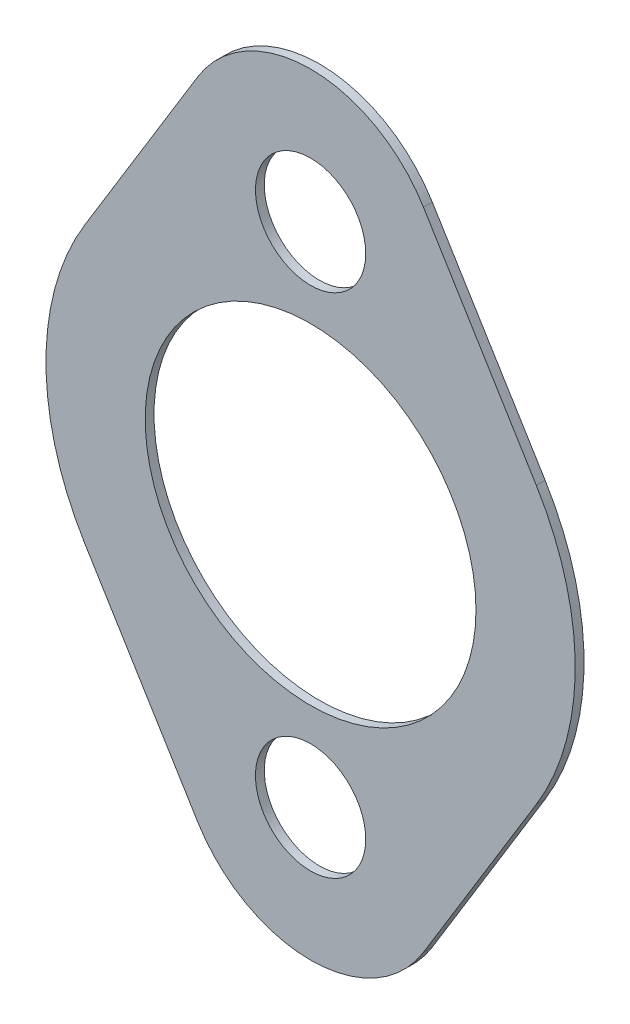
ISO-10303-21;
HEADER;
FILE_DESCRIPTION(('STEP AP214'),'2;1');
FILE_NAME('part.step','',(''),(''),'','','');
FILE_SCHEMA(('AUTOMOTIVE_DESIGN { 1 0 10303 214 1 1 1 1 }'));
ENDSEC;
DATA;
#1=APPLICATION_CONTEXT('core data for automotive mechanical design processes');
#2=APPLICATION_PROTOCOL_DEFINITION('international standard','automotive_design',2000,#1);
#3=PRODUCT_CONTEXT('',#1,'mechanical');
#4=PRODUCT('Part','Part','',(#3));
#5=PRODUCT_RELATED_PRODUCT_CATEGORY('part','',(#4));
#6=PRODUCT_DEFINITION_FORMATION('','',#4);
#7=PRODUCT_DEFINITION_CONTEXT('part definition',#1,'design');
#8=PRODUCT_DEFINITION('design','',#6,#7);
#9=PRODUCT_DEFINITION_SHAPE('','',#8);
#10=(LENGTH_UNIT() NAMED_UNIT(*) SI_UNIT(.MILLI.,.METRE.));
#11=(NAMED_UNIT(*) PLANE_ANGLE_UNIT() SI_UNIT($,.RADIAN.));
#12=(NAMED_UNIT(*) SI_UNIT($,.STERADIAN.) SOLID_ANGLE_UNIT());
#13=UNCERTAINTY_MEASURE_WITH_UNIT(LENGTH_MEASURE(1.E-05),#10,'distance_accuracy_value','');
#14=(GEOMETRIC_REPRESENTATION_CONTEXT(3) GLOBAL_UNCERTAINTY_ASSIGNED_CONTEXT((#13)) GLOBAL_UNIT_ASSIGNED_CONTEXT((#10,
#11,#12)) REPRESENTATION_CONTEXT('',''));
#15=CARTESIAN_POINT('',(0.,0.,0.));
#16=DIRECTION('',(0.,0.,1.));
#17=DIRECTION('',(1.,0.,0.));
#18=AXIS2_PLACEMENT_3D('',#15,#16,#17);
#19=CARTESIAN_POINT('',(0.,57.5,2.));
#20=DIRECTION('',(0.,0.,-1.));
#21=DIRECTION('',(-1.,0.,0.));
#22=AXIS2_PLACEMENT_3D('',#19,#20,#21);
#23=CYLINDRICAL_SURFACE('',#22,30.);
#24=CARTESIAN_POINT('',(0.,57.5,0.));
#25=DIRECTION('',(0.,0.,-1.));
#26=DIRECTION('',(-1.,0.,0.));
#27=AXIS2_PLACEMENT_3D('',#24,#25,#26);
#28=CIRCLE('',#27,30.);
#29=CARTESIAN_POINT('',(-25.5931524395851,73.1521739130435,0.));
#30=VERTEX_POINT('',#29);
#31=CARTESIAN_POINT('',(25.5931524395851,73.1521739130434,0.));
#32=VERTEX_POINT('',#31);
#33=EDGE_CURVE('E142',#30,#32,#28,.T.);
#34=ORIENTED_EDGE('',*,*,#33,.F.);
#35=DIRECTION('',(0.,0.,-1.));
#36=VECTOR('',#35,1.);
#37=CARTESIAN_POINT('',(-25.5931524395851,73.1521739130435,2.));
#38=LINE('',#37,#36);
#39=CARTESIAN_POINT('',(-25.5931524395851,73.1521739130435,2.));
#40=VERTEX_POINT('',#39);
#41=EDGE_CURVE('E11',#40,#30,#38,.T.);
#42=ORIENTED_EDGE('',*,*,#41,.F.);
#43=CARTESIAN_POINT('',(0.,57.5,2.));
#44=DIRECTION('',(0.,0.,-1.));
#45=DIRECTION('',(-1.,0.,0.));
#46=AXIS2_PLACEMENT_3D('',#43,#44,#45);
#47=CIRCLE('',#46,30.);
#48=CARTESIAN_POINT('',(25.5931524395851,73.1521739130434,2.));
#49=VERTEX_POINT('',#48);
#50=EDGE_CURVE('E169',#40,#49,#47,.T.);
#51=ORIENTED_EDGE('',*,*,#50,.T.);
#52=DIRECTION('',(0.,0.,-1.));
#53=VECTOR('',#52,1.);
#54=CARTESIAN_POINT('',(25.5931524395851,73.1521739130434,2.));
#55=LINE('',#54,#53);
#56=EDGE_CURVE('E42',#49,#32,#55,.T.);
#57=ORIENTED_EDGE('',*,*,#56,.T.);
#58=EDGE_LOOP('',(#34,#42,#51,#57));
#59=FACE_BOUND('',#58,.T.);
#60=ADVANCED_FACE('F39',(#59),#23,.T.);
#61=CARTESIAN_POINT('',(-25.5931524395851,73.1521739130435,2.));
#62=DIRECTION('',(0.853105081319504,-0.521739130434783,0.));
#63=DIRECTION('',(0.521739130434783,0.853105081319504,0.));
#64=AXIS2_PLACEMENT_3D('',#61,#62,#63);
#65=PLANE('',#64);
#66=DIRECTION('',(-0.521739130434782,-0.853105081319504,0.));
#67=VECTOR('',#66,1.);
#68=CARTESIAN_POINT('',(-25.5931524395851,73.1521739130435,0.));
#69=LINE('',#68,#67);
#70=CARTESIAN_POINT('',(-51.1863048791702,31.304347826087,0.));
#71=VERTEX_POINT('',#70);
#72=EDGE_CURVE('E167',#30,#71,#69,.T.);
#73=ORIENTED_EDGE('',*,*,#72,.T.);
#74=DIRECTION('',(0.,0.,-1.));
#75=VECTOR('',#74,1.);
#76=CARTESIAN_POINT('',(-51.1863048791702,31.304347826087,2.));
#77=LINE('',#76,#75);
#78=CARTESIAN_POINT('',(-51.1863048791702,31.304347826087,2.));
#79=VERTEX_POINT('',#78);
#80=EDGE_CURVE('E49',#79,#71,#77,.T.);
#81=ORIENTED_EDGE('',*,*,#80,.F.);
#82=DIRECTION('',(-0.521739130434782,-0.853105081319504,0.));
#83=VECTOR('',#82,1.);
#84=CARTESIAN_POINT('',(-25.5931524395851,73.1521739130435,2.));
#85=LINE('',#84,#83);
#86=EDGE_CURVE('E127',#40,#79,#85,.T.);
#87=ORIENTED_EDGE('',*,*,#86,.F.);
#88=ORIENTED_EDGE('',*,*,#41,.T.);
#89=EDGE_LOOP('',(#73,#81,#87,#88));
#90=FACE_BOUND('',#89,.T.);
#91=ADVANCED_FACE('F188',(#90),#65,.F.);
#92=CARTESIAN_POINT('',(0.,0.,2.));
#93=DIRECTION('',(0.,0.,-1.));
#94=DIRECTION('',(-1.,0.,0.));
#95=AXIS2_PLACEMENT_3D('',#92,#93,#94);
#96=CYLINDRICAL_SURFACE('',#95,60.);
#97=CARTESIAN_POINT('',(0.,0.,0.));
#98=DIRECTION('',(0.,0.,-1.));
#99=DIRECTION('',(-1.,0.,0.));
#100=AXIS2_PLACEMENT_3D('',#97,#98,#99);
#101=CIRCLE('',#100,60.);
#102=CARTESIAN_POINT('',(-51.1863048791702,-31.304347826087,0.));
#103=VERTEX_POINT('',#102);
#104=EDGE_CURVE('E114',#103,#71,#101,.T.);
#105=ORIENTED_EDGE('',*,*,#104,.F.);
#106=DIRECTION('',(0.,0.,-1.));
#107=VECTOR('',#106,1.);
#108=CARTESIAN_POINT('',(-51.1863048791702,-31.304347826087,2.));
#109=LINE('',#108,#107);
#110=CARTESIAN_POINT('',(-51.1863048791702,-31.304347826087,2.));
#111=VERTEX_POINT('',#110);
#112=EDGE_CURVE('E109',#111,#103,#109,.T.);
#113=ORIENTED_EDGE('',*,*,#112,.F.);
#114=CARTESIAN_POINT('',(0.,0.,2.));
#115=DIRECTION('',(0.,0.,-1.));
#116=DIRECTION('',(-1.,0.,0.));
#117=AXIS2_PLACEMENT_3D('',#114,#115,#116);
#118=CIRCLE('',#117,60.);
#119=EDGE_CURVE('E112',#111,#79,#118,.T.);
#120=ORIENTED_EDGE('',*,*,#119,.T.);
#121=ORIENTED_EDGE('',*,*,#80,.T.);
#122=EDGE_LOOP('',(#105,#113,#120,#121));
#123=FACE_BOUND('',#122,.T.);
#124=ADVANCED_FACE('F111',(#123),#96,.T.);
#125=CARTESIAN_POINT('',(-25.5931524395851,-73.1521739130435,2.));
#126=DIRECTION('',(-0.853105081319504,-0.521739130434783,0.));
#127=DIRECTION('',(0.521739130434783,-0.853105081319504,0.));
#128=AXIS2_PLACEMENT_3D('',#125,#126,#127);
#129=PLANE('',#128);
#130=DIRECTION('',(-0.521739130434782,0.853105081319504,0.));
#131=VECTOR('',#130,1.);
#132=CARTESIAN_POINT('',(-25.5931524395851,-73.1521739130435,0.));
#133=LINE('',#132,#131);
#134=CARTESIAN_POINT('',(-25.5931524395851,-73.1521739130435,0.));
#135=VERTEX_POINT('',#134);
#136=EDGE_CURVE('E162',#135,#103,#133,.T.);
#137=ORIENTED_EDGE('',*,*,#136,.F.);
#138=DIRECTION('',(0.,0.,-1.));
#139=VECTOR('',#138,1.);
#140=CARTESIAN_POINT('',(-25.5931524395851,-73.1521739130435,2.));
#141=LINE('',#140,#139);
#142=CARTESIAN_POINT('',(-25.5931524395851,-73.1521739130435,2.));
#143=VERTEX_POINT('',#142);
#144=EDGE_CURVE('E120',#143,#135,#141,.T.);
#145=ORIENTED_EDGE('',*,*,#144,.F.);
#146=DIRECTION('',(-0.521739130434782,0.853105081319504,0.));
#147=VECTOR('',#146,1.);
#148=CARTESIAN_POINT('',(-25.5931524395851,-73.1521739130435,2.));
#149=LINE('',#148,#147);
#150=EDGE_CURVE('E126',#143,#111,#149,.T.);
#151=ORIENTED_EDGE('',*,*,#150,.T.);
#152=ORIENTED_EDGE('',*,*,#112,.T.);
#153=EDGE_LOOP('',(#137,#145,#151,#152));
#154=FACE_BOUND('',#153,.T.);
#155=ADVANCED_FACE('F130',(#154),#129,.T.);
#156=CARTESIAN_POINT('',(0.,-57.5,2.));
#157=DIRECTION('',(0.,0.,-1.));
#158=DIRECTION('',(-1.,0.,0.));
#159=AXIS2_PLACEMENT_3D('',#156,#157,#158);
#160=CYLINDRICAL_SURFACE('',#159,30.);
#161=CARTESIAN_POINT('',(0.,-57.5,0.));
#162=DIRECTION('',(0.,0.,1.));
#163=DIRECTION('',(1.,0.,0.));
#164=AXIS2_PLACEMENT_3D('',#161,#162,#163);
#165=CIRCLE('',#164,30.);
#166=CARTESIAN_POINT('',(25.5931524395851,-73.1521739130435,0.));
#167=VERTEX_POINT('',#166);
#168=EDGE_CURVE('E159',#135,#167,#165,.T.);
#169=ORIENTED_EDGE('',*,*,#168,.T.);
#170=DIRECTION('',(0.,0.,-1.));
#171=VECTOR('',#170,1.);
#172=CARTESIAN_POINT('',(25.5931524395851,-73.1521739130435,2.));
#173=LINE('',#172,#171);
#174=CARTESIAN_POINT('',(25.5931524395851,-73.1521739130435,2.));
#175=VERTEX_POINT('',#174);
#176=EDGE_CURVE('E175',#175,#167,#173,.T.);
#177=ORIENTED_EDGE('',*,*,#176,.F.);
#178=CARTESIAN_POINT('',(0.,-57.5,2.));
#179=DIRECTION('',(0.,0.,1.));
#180=DIRECTION('',(1.,0.,0.));
#181=AXIS2_PLACEMENT_3D('',#178,#179,#180);
#182=CIRCLE('',#181,30.);
#183=EDGE_CURVE('E133',#143,#175,#182,.T.);
#184=ORIENTED_EDGE('',*,*,#183,.F.);
#185=ORIENTED_EDGE('',*,*,#144,.T.);
#186=EDGE_LOOP('',(#169,#177,#184,#185));
#187=FACE_BOUND('',#186,.T.);
#188=ADVANCED_FACE('F213',(#187),#160,.T.);
#189=CARTESIAN_POINT('',(25.5931524395851,-73.1521739130434,2.));
#190=DIRECTION('',(-0.853105081319504,0.521739130434782,0.));
#191=DIRECTION('',(-0.521739130434782,-0.853105081319504,0.));
#192=AXIS2_PLACEMENT_3D('',#189,#190,#191);
#193=PLANE('',#192);
#194=DIRECTION('',(0.521739130434782,0.853105081319504,0.));
#195=VECTOR('',#194,1.);
#196=CARTESIAN_POINT('',(25.5931524395851,-73.1521739130434,0.));
#197=LINE('',#196,#195);
#198=CARTESIAN_POINT('',(51.1863048791702,-31.3043478260869,0.));
#199=VERTEX_POINT('',#198);
#200=EDGE_CURVE('E155',#167,#199,#197,.T.);
#201=ORIENTED_EDGE('',*,*,#200,.T.);
#202=DIRECTION('',(0.,0.,-1.));
#203=VECTOR('',#202,1.);
#204=CARTESIAN_POINT('',(51.1863048791702,-31.3043478260869,2.));
#205=LINE('',#204,#203);
#206=CARTESIAN_POINT('',(51.1863048791702,-31.3043478260869,2.));
#207=VERTEX_POINT('',#206);
#208=EDGE_CURVE('E179',#207,#199,#205,.T.);
#209=ORIENTED_EDGE('',*,*,#208,.F.);
#210=DIRECTION('',(0.521739130434782,0.853105081319504,0.));
#211=VECTOR('',#210,1.);
#212=CARTESIAN_POINT('',(25.5931524395851,-73.1521739130434,2.));
#213=LINE('',#212,#211);
#214=EDGE_CURVE('E136',#175,#207,#213,.T.);
#215=ORIENTED_EDGE('',*,*,#214,.F.);
#216=ORIENTED_EDGE('',*,*,#176,.T.);
#217=EDGE_LOOP('',(#201,#209,#215,#216));
#218=FACE_BOUND('',#217,.T.);
#219=ADVANCED_FACE('F207',(#218),#193,.F.);
#220=CARTESIAN_POINT('',(0.,0.,2.));
#221=DIRECTION('',(0.,0.,-1.));
#222=DIRECTION('',(-1.,0.,0.));
#223=AXIS2_PLACEMENT_3D('',#220,#221,#222);
#224=CYLINDRICAL_SURFACE('',#223,60.);
#225=CARTESIAN_POINT('',(0.,0.,0.));
#226=DIRECTION('',(0.,0.,-1.));
#227=DIRECTION('',(-1.,0.,0.));
#228=AXIS2_PLACEMENT_3D('',#225,#226,#227);
#229=CIRCLE('',#228,60.);
#230=CARTESIAN_POINT('',(51.1863048791702,31.3043478260869,0.));
#231=VERTEX_POINT('',#230);
#232=EDGE_CURVE('E151',#231,#199,#229,.T.);
#233=ORIENTED_EDGE('',*,*,#232,.F.);
#234=DIRECTION('',(0.,0.,-1.));
#235=VECTOR('',#234,1.);
#236=CARTESIAN_POINT('',(51.1863048791702,31.3043478260869,2.));
#237=LINE('',#236,#235);
#238=CARTESIAN_POINT('',(51.1863048791702,31.3043478260869,2.));
#239=VERTEX_POINT('',#238);
#240=EDGE_CURVE('E181',#239,#231,#237,.T.);
#241=ORIENTED_EDGE('',*,*,#240,.F.);
#242=CARTESIAN_POINT('',(0.,0.,2.));
#243=DIRECTION('',(0.,0.,-1.));
#244=DIRECTION('',(-1.,0.,0.));
#245=AXIS2_PLACEMENT_3D('',#242,#243,#244);
#246=CIRCLE('',#245,60.);
#247=EDGE_CURVE('E194',#239,#207,#246,.T.);
#248=ORIENTED_EDGE('',*,*,#247,.T.);
#249=ORIENTED_EDGE('',*,*,#208,.T.);
#250=EDGE_LOOP('',(#233,#241,#248,#249));
#251=FACE_BOUND('',#250,.T.);
#252=ADVANCED_FACE('F210',(#251),#224,.T.);
#253=CARTESIAN_POINT('',(25.5931524395851,73.1521739130434,2.));
#254=DIRECTION('',(0.853105081319504,0.521739130434782,0.));
#255=DIRECTION('',(-0.521739130434782,0.853105081319504,0.));
#256=AXIS2_PLACEMENT_3D('',#253,#254,#255);
#257=PLANE('',#256);
#258=DIRECTION('',(0.521739130434782,-0.853105081319504,0.));
#259=VECTOR('',#258,1.);
#260=CARTESIAN_POINT('',(25.5931524395851,73.1521739130434,0.));
#261=LINE('',#260,#259);
#262=EDGE_CURVE('E146',#32,#231,#261,.T.);
#263=ORIENTED_EDGE('',*,*,#262,.F.);
#264=ORIENTED_EDGE('',*,*,#56,.F.);
#265=DIRECTION('',(0.521739130434782,-0.853105081319504,0.));
#266=VECTOR('',#265,1.);
#267=CARTESIAN_POINT('',(25.5931524395851,73.1521739130434,2.));
#268=LINE('',#267,#266);
#269=EDGE_CURVE('E190',#49,#239,#268,.T.);
#270=ORIENTED_EDGE('',*,*,#269,.T.);
#271=ORIENTED_EDGE('',*,*,#240,.T.);
#272=EDGE_LOOP('',(#263,#264,#270,#271));
#273=FACE_BOUND('',#272,.T.);
#274=ADVANCED_FACE('F185',(#273),#257,.T.);
#275=CARTESIAN_POINT('',(0.,57.5,2.));
#276=DIRECTION('',(0.,0.,-1.));
#277=DIRECTION('',(-1.,0.,0.));
#278=AXIS2_PLACEMENT_3D('',#275,#276,#277);
#279=PLANE('',#278);
#280=CARTESIAN_POINT('',(0.,-57.5,2.));
#281=DIRECTION('',(0.,0.,1.));
#282=DIRECTION('',(1.,0.,0.));
#283=AXIS2_PLACEMENT_3D('',#280,#281,#282);
#284=CIRCLE('',#283,12.5);
#285=CARTESIAN_POINT('',(12.5,-57.5,2.));
#286=VERTEX_POINT('',#285);
#287=EDGE_CURVE('E257',#286,#286,#284,.T.);
#288=ORIENTED_EDGE('',*,*,#287,.F.);
#289=EDGE_LOOP('',(#288));
#290=FACE_BOUND('',#289,.T.);
#291=CARTESIAN_POINT('',(0.,0.,2.));
#292=DIRECTION('',(0.,0.,1.));
#293=DIRECTION('',(1.,0.,0.));
#294=AXIS2_PLACEMENT_3D('',#291,#292,#293);
#295=CIRCLE('',#294,37.5);
#296=CARTESIAN_POINT('',(37.5,0.,2.));
#297=VERTEX_POINT('',#296);
#298=EDGE_CURVE('E265',#297,#297,#295,.T.);
#299=ORIENTED_EDGE('',*,*,#298,.F.);
#300=EDGE_LOOP('',(#299));
#301=FACE_BOUND('',#300,.T.);
#302=CARTESIAN_POINT('',(0.,57.5,2.));
#303=DIRECTION('',(0.,0.,1.));
#304=DIRECTION('',(1.,0.,0.));
#305=AXIS2_PLACEMENT_3D('',#302,#303,#304);
#306=CIRCLE('',#305,12.5);
#307=CARTESIAN_POINT('',(12.5,57.5,2.));
#308=VERTEX_POINT('',#307);
#309=EDGE_CURVE('E197',#308,#308,#306,.T.);
#310=ORIENTED_EDGE('',*,*,#309,.F.);
#311=EDGE_LOOP('',(#310));
#312=FACE_BOUND('',#311,.T.);
#313=ORIENTED_EDGE('',*,*,#50,.F.);
#314=ORIENTED_EDGE('',*,*,#86,.T.);
#315=ORIENTED_EDGE('',*,*,#119,.F.);
#316=ORIENTED_EDGE('',*,*,#150,.F.);
#317=ORIENTED_EDGE('',*,*,#183,.T.);
#318=ORIENTED_EDGE('',*,*,#214,.T.);
#319=ORIENTED_EDGE('',*,*,#247,.F.);
#320=ORIENTED_EDGE('',*,*,#269,.F.);
#321=EDGE_LOOP('',(#313,#314,#315,#316,#317,#318,#319,#320));
#322=FACE_BOUND('',#321,.T.);
#323=ADVANCED_FACE('F125',(#290,#301,#312,#322),#279,.F.);
#324=CARTESIAN_POINT('',(0.,57.5,0.));
#325=DIRECTION('',(0.,0.,-1.));
#326=DIRECTION('',(-1.,0.,0.));
#327=AXIS2_PLACEMENT_3D('',#324,#325,#326);
#328=PLANE('',#327);
#329=CARTESIAN_POINT('',(0.,-57.5,0.));
#330=DIRECTION('',(0.,0.,1.));
#331=DIRECTION('',(1.,0.,0.));
#332=AXIS2_PLACEMENT_3D('',#329,#330,#331);
#333=CIRCLE('',#332,12.5);
#334=CARTESIAN_POINT('',(12.5,-57.5,0.));
#335=VERTEX_POINT('',#334);
#336=EDGE_CURVE('E254',#335,#335,#333,.T.);
#337=ORIENTED_EDGE('',*,*,#336,.T.);
#338=EDGE_LOOP('',(#337));
#339=FACE_BOUND('',#338,.T.);
#340=CARTESIAN_POINT('',(0.,0.,0.));
#341=DIRECTION('',(0.,0.,1.));
#342=DIRECTION('',(1.,0.,0.));
#343=AXIS2_PLACEMENT_3D('',#340,#341,#342);
#344=CIRCLE('',#343,37.5);
#345=CARTESIAN_POINT('',(37.5,0.,0.));
#346=VERTEX_POINT('',#345);
#347=EDGE_CURVE('E259',#346,#346,#344,.T.);
#348=ORIENTED_EDGE('',*,*,#347,.T.);
#349=EDGE_LOOP('',(#348));
#350=FACE_BOUND('',#349,.T.);
#351=CARTESIAN_POINT('',(0.,57.5,0.));
#352=DIRECTION('',(0.,0.,1.));
#353=DIRECTION('',(1.,0.,0.));
#354=AXIS2_PLACEMENT_3D('',#351,#352,#353);
#355=CIRCLE('',#354,12.5);
#356=CARTESIAN_POINT('',(12.5,57.5,0.));
#357=VERTEX_POINT('',#356);
#358=EDGE_CURVE('E147',#357,#357,#355,.T.);
#359=ORIENTED_EDGE('',*,*,#358,.T.);
#360=EDGE_LOOP('',(#359));
#361=FACE_BOUND('',#360,.T.);
#362=ORIENTED_EDGE('',*,*,#33,.T.);
#363=ORIENTED_EDGE('',*,*,#262,.T.);
#364=ORIENTED_EDGE('',*,*,#232,.T.);
#365=ORIENTED_EDGE('',*,*,#200,.F.);
#366=ORIENTED_EDGE('',*,*,#168,.F.);
#367=ORIENTED_EDGE('',*,*,#136,.T.);
#368=ORIENTED_EDGE('',*,*,#104,.T.);
#369=ORIENTED_EDGE('',*,*,#72,.F.);
#370=EDGE_LOOP('',(#362,#363,#364,#365,#366,#367,#368,#369));
#371=FACE_BOUND('',#370,.T.);
#372=ADVANCED_FACE('F187',(#339,#350,#361,#371),#328,.T.);
#373=CARTESIAN_POINT('',(0.,57.5,0.));
#374=DIRECTION('',(0.,0.,1.));
#375=DIRECTION('',(1.,0.,0.));
#376=AXIS2_PLACEMENT_3D('',#373,#374,#375);
#377=CYLINDRICAL_SURFACE('',#376,12.5);
#378=ORIENTED_EDGE('',*,*,#358,.F.);
#379=EDGE_LOOP('',(#378));
#380=FACE_BOUND('',#379,.T.);
#381=ORIENTED_EDGE('',*,*,#309,.T.);
#382=EDGE_LOOP('',(#381));
#383=FACE_BOUND('',#382,.T.);
#384=ADVANCED_FACE('F234',(#380,#383),#377,.F.);
#385=CARTESIAN_POINT('',(0.,0.,0.));
#386=DIRECTION('',(0.,0.,1.));
#387=DIRECTION('',(1.,0.,0.));
#388=AXIS2_PLACEMENT_3D('',#385,#386,#387);
#389=CYLINDRICAL_SURFACE('',#388,37.5);
#390=ORIENTED_EDGE('',*,*,#347,.F.);
#391=EDGE_LOOP('',(#390));
#392=FACE_BOUND('',#391,.T.);
#393=ORIENTED_EDGE('',*,*,#298,.T.);
#394=EDGE_LOOP('',(#393));
#395=FACE_BOUND('',#394,.T.);
#396=ADVANCED_FACE('F241',(#392,#395),#389,.F.);
#397=CARTESIAN_POINT('',(0.,-57.5,0.));
#398=DIRECTION('',(0.,0.,1.));
#399=DIRECTION('',(1.,0.,0.));
#400=AXIS2_PLACEMENT_3D('',#397,#398,#399);
#401=CYLINDRICAL_SURFACE('',#400,12.5);
#402=ORIENTED_EDGE('',*,*,#336,.F.);
#403=EDGE_LOOP('',(#402));
#404=FACE_BOUND('',#403,.T.);
#405=ORIENTED_EDGE('',*,*,#287,.T.);
#406=EDGE_LOOP('',(#405));
#407=FACE_BOUND('',#406,.T.);
#408=ADVANCED_FACE('F245',(#404,#407),#401,.F.);
#409=CLOSED_SHELL('',(#60,#91,#124,#155,#188,#219,#252,#274,#323,#372,#384,#396,#408));
#410=MANIFOLD_SOLID_BREP('B2',#409);
#411=ADVANCED_BREP_SHAPE_REPRESENTATION('',(#18,#410),#14);
#412=SHAPE_DEFINITION_REPRESENTATION(#9,#411);
ENDSEC;
END-ISO-10303-21;
